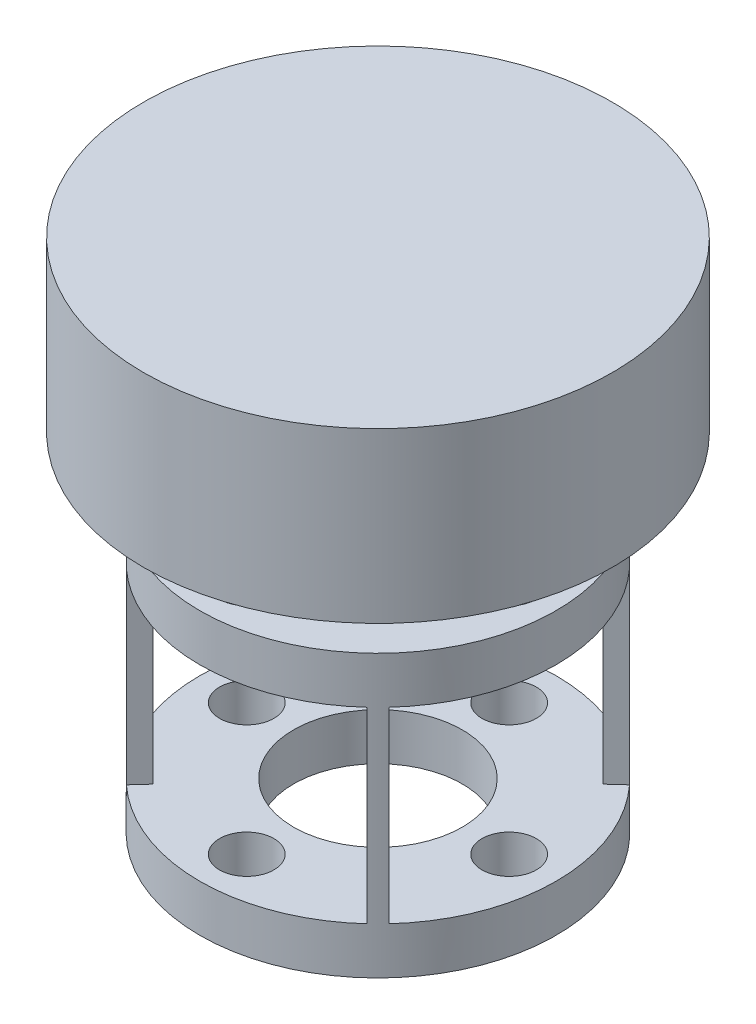
ISO-10303-21;
HEADER;
FILE_DESCRIPTION(('STEP AP214'),'2;1');
FILE_NAME('part.step','',(''),(''),'','','');
FILE_SCHEMA(('AUTOMOTIVE_DESIGN { 1 0 10303 214 1 1 1 1 }'));
ENDSEC;
DATA;
#1=APPLICATION_CONTEXT('core data for automotive mechanical design processes');
#2=APPLICATION_PROTOCOL_DEFINITION('international standard','automotive_design',2000,#1);
#3=PRODUCT_CONTEXT('',#1,'mechanical');
#4=PRODUCT('Part','Part','',(#3));
#5=PRODUCT_RELATED_PRODUCT_CATEGORY('part','',(#4));
#6=PRODUCT_DEFINITION_FORMATION('','',#4);
#7=PRODUCT_DEFINITION_CONTEXT('part definition',#1,'design');
#8=PRODUCT_DEFINITION('design','',#6,#7);
#9=PRODUCT_DEFINITION_SHAPE('','',#8);
#10=(LENGTH_UNIT() NAMED_UNIT(*) SI_UNIT(.MILLI.,.METRE.));
#11=(NAMED_UNIT(*) PLANE_ANGLE_UNIT() SI_UNIT($,.RADIAN.));
#12=(NAMED_UNIT(*) SI_UNIT($,.STERADIAN.) SOLID_ANGLE_UNIT());
#13=UNCERTAINTY_MEASURE_WITH_UNIT(LENGTH_MEASURE(1.E-05),#10,'distance_accuracy_value','');
#14=(GEOMETRIC_REPRESENTATION_CONTEXT(3) GLOBAL_UNCERTAINTY_ASSIGNED_CONTEXT((#13)) GLOBAL_UNIT_ASSIGNED_CONTEXT((#10,
#11,#12)) REPRESENTATION_CONTEXT('',''));
#15=CARTESIAN_POINT('',(0.,0.,0.));
#16=DIRECTION('',(0.,0.,1.));
#17=DIRECTION('',(1.,0.,0.));
#18=AXIS2_PLACEMENT_3D('',#15,#16,#17);
#19=CARTESIAN_POINT('',(0.,55.,0.));
#20=DIRECTION('',(0.,-1.,0.));
#21=DIRECTION('',(0.,0.,-1.));
#22=AXIS2_PLACEMENT_3D('',#19,#20,#21);
#23=CYLINDRICAL_SURFACE('',#22,2.5);
#24=CARTESIAN_POINT('',(0.,35.,0.));
#25=DIRECTION('',(0.,1.,0.));
#26=DIRECTION('',(0.,0.,1.));
#27=AXIS2_PLACEMENT_3D('',#24,#25,#26);
#28=CIRCLE('',#27,2.5);
#29=CARTESIAN_POINT('',(0.,35.,2.5));
#30=VERTEX_POINT('',#29);
#31=EDGE_CURVE('E259',#30,#30,#28,.T.);
#32=ORIENTED_EDGE('',*,*,#31,.T.);
#33=EDGE_LOOP('',(#32));
#34=FACE_BOUND('',#33,.T.);
#35=CARTESIAN_POINT('',(0.,37.,0.));
#36=DIRECTION('',(0.,1.,0.));
#37=DIRECTION('',(0.,0.,1.));
#38=AXIS2_PLACEMENT_3D('',#35,#36,#37);
#39=CIRCLE('',#38,2.5);
#40=CARTESIAN_POINT('',(0.,37.,2.5));
#41=VERTEX_POINT('',#40);
#42=EDGE_CURVE('E12',#41,#41,#39,.T.);
#43=ORIENTED_EDGE('',*,*,#42,.F.);
#44=EDGE_LOOP('',(#43));
#45=FACE_BOUND('',#44,.T.);
#46=ADVANCED_FACE('F53',(#34,#45),#23,.T.);
#47=CARTESIAN_POINT('',(0.,5.,0.));
#48=DIRECTION('',(0.,1.,0.));
#49=DIRECTION('',(0.,0.,1.));
#50=AXIS2_PLACEMENT_3D('',#47,#48,#49);
#51=PLANE('',#50);
#52=CARTESIAN_POINT('',(0.,5.,0.));
#53=DIRECTION('',(0.,1.,0.));
#54=DIRECTION('',(0.,0.,1.));
#55=AXIS2_PLACEMENT_3D('',#52,#53,#54);
#56=CIRCLE('',#55,9.);
#57=CARTESIAN_POINT('',(0.,5.,9.));
#58=VERTEX_POINT('',#57);
#59=EDGE_CURVE('E297',#58,#58,#56,.F.);
#60=ORIENTED_EDGE('',*,*,#59,.T.);
#61=EDGE_LOOP('',(#60));
#62=FACE_BOUND('',#61,.T.);
#63=CARTESIAN_POINT('',(14.,5.,0.));
#64=DIRECTION('',(0.,1.,0.));
#65=DIRECTION('',(0.,0.,1.));
#66=AXIS2_PLACEMENT_3D('',#63,#64,#65);
#67=CIRCLE('',#66,2.9);
#68=CARTESIAN_POINT('',(14.,5.,2.9));
#69=VERTEX_POINT('',#68);
#70=EDGE_CURVE('E365',#69,#69,#67,.F.);
#71=ORIENTED_EDGE('',*,*,#70,.T.);
#72=EDGE_LOOP('',(#71));
#73=FACE_BOUND('',#72,.T.);
#74=CARTESIAN_POINT('',(0.,5.,14.));
#75=DIRECTION('',(0.,1.,0.));
#76=DIRECTION('',(0.,0.,1.));
#77=AXIS2_PLACEMENT_3D('',#74,#75,#76);
#78=CIRCLE('',#77,2.9);
#79=CARTESIAN_POINT('',(0.,5.,16.9));
#80=VERTEX_POINT('',#79);
#81=EDGE_CURVE('E357',#80,#80,#78,.F.);
#82=ORIENTED_EDGE('',*,*,#81,.T.);
#83=EDGE_LOOP('',(#82));
#84=FACE_BOUND('',#83,.T.);
#85=CARTESIAN_POINT('',(0.,5.,-14.));
#86=DIRECTION('',(0.,1.,0.));
#87=DIRECTION('',(0.,0.,1.));
#88=AXIS2_PLACEMENT_3D('',#85,#86,#87);
#89=CIRCLE('',#88,2.9);
#90=CARTESIAN_POINT('',(0.,5.,-11.1));
#91=VERTEX_POINT('',#90);
#92=EDGE_CURVE('E349',#91,#91,#89,.F.);
#93=ORIENTED_EDGE('',*,*,#92,.T.);
#94=EDGE_LOOP('',(#93));
#95=FACE_BOUND('',#94,.T.);
#96=CARTESIAN_POINT('',(-14.,5.,0.));
#97=DIRECTION('',(0.,1.,0.));
#98=DIRECTION('',(0.,0.,1.));
#99=AXIS2_PLACEMENT_3D('',#96,#97,#98);
#100=CIRCLE('',#99,2.9);
#101=CARTESIAN_POINT('',(-14.,5.,2.9));
#102=VERTEX_POINT('',#101);
#103=EDGE_CURVE('E341',#102,#102,#100,.F.);
#104=ORIENTED_EDGE('',*,*,#103,.T.);
#105=EDGE_LOOP('',(#104));
#106=FACE_BOUND('',#105,.T.);
#107=CARTESIAN_POINT('',(0.,5.,0.));
#108=DIRECTION('',(0.,1.,0.));
#109=DIRECTION('',(0.,0.,1.));
#110=AXIS2_PLACEMENT_3D('',#107,#108,#109);
#111=CIRCLE('',#110,19.);
#112=CARTESIAN_POINT('',(-12.8362139446975,5.,14.0082693993924));
#113=VERTEX_POINT('',#112);
#114=CARTESIAN_POINT('',(12.8362139446977,5.,14.0082693993922));
#115=VERTEX_POINT('',#114);
#116=EDGE_CURVE('E252',#113,#115,#111,.T.);
#117=ORIENTED_EDGE('',*,*,#116,.T.);
#118=DIRECTION('',(-0.675590207615618,0.,-0.737277336810162));
#119=VECTOR('',#118,1.);
#120=CARTESIAN_POINT('',(12.8362139446977,5.,14.0082693993922));
#121=LINE('',#120,#119);
#122=CARTESIAN_POINT('',(11.4850335294665,5.,12.5337147257719));
#123=VERTEX_POINT('',#122);
#124=EDGE_CURVE('E69',#115,#123,#121,.T.);
#125=ORIENTED_EDGE('',*,*,#124,.T.);
#126=CARTESIAN_POINT('',(0.,5.,0.));
#127=DIRECTION('',(0.,-1.,0.));
#128=DIRECTION('',(0.,0.,-1.));
#129=AXIS2_PLACEMENT_3D('',#126,#127,#128);
#130=CIRCLE('',#129,17.);
#131=CARTESIAN_POINT('',(12.5337147257722,5.,11.4850335294661));
#132=VERTEX_POINT('',#131);
#133=EDGE_CURVE('E447',#132,#123,#130,.T.);
#134=ORIENTED_EDGE('',*,*,#133,.F.);
#135=DIRECTION('',(-0.737277336810099,0.,-0.675590207615687));
#136=VECTOR('',#135,1.);
#137=CARTESIAN_POINT('',(14.0082693993924,5.,12.8362139446975));
#138=LINE('',#137,#136);
#139=CARTESIAN_POINT('',(14.0082693993924,5.,12.8362139446975));
#140=VERTEX_POINT('',#139);
#141=EDGE_CURVE('E212',#140,#132,#138,.T.);
#142=ORIENTED_EDGE('',*,*,#141,.F.);
#143=CARTESIAN_POINT('',(14.0082693993922,5.,-12.8362139446977));
#144=VERTEX_POINT('',#143);
#145=EDGE_CURVE('E186',#140,#144,#111,.T.);
#146=ORIENTED_EDGE('',*,*,#145,.T.);
#147=DIRECTION('',(-0.737277336810131,0.,0.675590207615653));
#148=VECTOR('',#147,1.);
#149=CARTESIAN_POINT('',(14.0082693993922,5.,-12.8362139446977));
#150=LINE('',#149,#148);
#151=CARTESIAN_POINT('',(12.5337147257719,5.,-11.4850335294664));
#152=VERTEX_POINT('',#151);
#153=EDGE_CURVE('E76',#144,#152,#150,.T.);
#154=ORIENTED_EDGE('',*,*,#153,.T.);
#155=CARTESIAN_POINT('',(0.,5.,0.));
#156=DIRECTION('',(0.,-1.,0.));
#157=DIRECTION('',(0.,0.,-1.));
#158=AXIS2_PLACEMENT_3D('',#155,#156,#157);
#159=CIRCLE('',#158,17.);
#160=CARTESIAN_POINT('',(11.4850335294662,5.,-12.5337147257722));
#161=VERTEX_POINT('',#160);
#162=EDGE_CURVE('E429',#161,#152,#159,.T.);
#163=ORIENTED_EDGE('',*,*,#162,.F.);
#164=DIRECTION('',(-0.675590207615654,0.,0.73727733681013));
#165=VECTOR('',#164,1.);
#166=CARTESIAN_POINT('',(12.8362139446975,5.,-14.0082693993924));
#167=LINE('',#166,#165);
#168=CARTESIAN_POINT('',(12.8362139446975,5.,-14.0082693993924));
#169=VERTEX_POINT('',#168);
#170=EDGE_CURVE('E425',#169,#161,#167,.T.);
#171=ORIENTED_EDGE('',*,*,#170,.F.);
#172=CARTESIAN_POINT('',(-12.8362139446977,5.,-14.0082693993922));
#173=VERTEX_POINT('',#172);
#174=EDGE_CURVE('E455',#169,#173,#111,.T.);
#175=ORIENTED_EDGE('',*,*,#174,.T.);
#176=DIRECTION('',(0.675590207615668,0.,0.737277336810117));
#177=VECTOR('',#176,1.);
#178=CARTESIAN_POINT('',(-12.8362139446977,5.,-14.0082693993922));
#179=LINE('',#178,#177);
#180=CARTESIAN_POINT('',(-11.4850335294664,5.,-12.533714725772));
#181=VERTEX_POINT('',#180);
#182=EDGE_CURVE('E229',#173,#181,#179,.T.);
#183=ORIENTED_EDGE('',*,*,#182,.T.);
#184=CARTESIAN_POINT('',(0.,5.,0.));
#185=DIRECTION('',(0.,-1.,0.));
#186=DIRECTION('',(0.,0.,-1.));
#187=AXIS2_PLACEMENT_3D('',#184,#185,#186);
#188=CIRCLE('',#187,17.);
#189=CARTESIAN_POINT('',(-12.5337147257722,5.,-11.4850335294661));
#190=VERTEX_POINT('',#189);
#191=EDGE_CURVE('E395',#190,#181,#188,.T.);
#192=ORIENTED_EDGE('',*,*,#191,.F.);
#193=DIRECTION('',(0.737277336810127,0.,0.675590207615657));
#194=VECTOR('',#193,1.);
#195=CARTESIAN_POINT('',(-14.0082693993924,5.,-12.8362139446975));
#196=LINE('',#195,#194);
#197=CARTESIAN_POINT('',(-14.0082693993924,5.,-12.8362139446975));
#198=VERTEX_POINT('',#197);
#199=EDGE_CURVE('E391',#198,#190,#196,.T.);
#200=ORIENTED_EDGE('',*,*,#199,.F.);
#201=CARTESIAN_POINT('',(-14.0082693993922,5.,12.8362139446977));
#202=VERTEX_POINT('',#201);
#203=EDGE_CURVE('E255',#198,#202,#111,.T.);
#204=ORIENTED_EDGE('',*,*,#203,.T.);
#205=DIRECTION('',(0.737277336810131,0.,-0.675590207615653));
#206=VECTOR('',#205,1.);
#207=CARTESIAN_POINT('',(-14.0082693993922,5.,12.8362139446977));
#208=LINE('',#207,#206);
#209=CARTESIAN_POINT('',(-12.5337147257719,5.,11.4850335294664));
#210=VERTEX_POINT('',#209);
#211=EDGE_CURVE('E225',#202,#210,#208,.T.);
#212=ORIENTED_EDGE('',*,*,#211,.T.);
#213=CARTESIAN_POINT('',(0.,5.,0.));
#214=DIRECTION('',(0.,-1.,0.));
#215=DIRECTION('',(0.,0.,-1.));
#216=AXIS2_PLACEMENT_3D('',#213,#214,#215);
#217=CIRCLE('',#216,17.);
#218=CARTESIAN_POINT('',(-11.4850335294662,5.,12.5337147257722));
#219=VERTEX_POINT('',#218);
#220=EDGE_CURVE('E228',#219,#210,#217,.T.);
#221=ORIENTED_EDGE('',*,*,#220,.F.);
#222=DIRECTION('',(0.675590207615654,0.,-0.73727733681013));
#223=VECTOR('',#222,1.);
#224=CARTESIAN_POINT('',(-12.8362139446975,5.,14.0082693993924));
#225=LINE('',#224,#223);
#226=EDGE_CURVE('E218',#113,#219,#225,.T.);
#227=ORIENTED_EDGE('',*,*,#226,.F.);
#228=EDGE_LOOP('',(#117,#125,#134,#142,#146,#154,#163,#171,#175,#183,#192,#200,#204,#212,#221,#227));
#229=FACE_BOUND('',#228,.T.);
#230=ADVANCED_FACE('F277',(#62,#73,#84,#95,#106,#229),#51,.T.);
#231=CARTESIAN_POINT('',(0.,5.,0.));
#232=DIRECTION('',(0.,-1.,0.));
#233=DIRECTION('',(0.,0.,-1.));
#234=AXIS2_PLACEMENT_3D('',#231,#232,#233);
#235=CYLINDRICAL_SURFACE('',#234,19.);
#236=CARTESIAN_POINT('',(0.,25.,0.));
#237=DIRECTION('',(0.,1.,0.));
#238=DIRECTION('',(0.,0.,1.));
#239=AXIS2_PLACEMENT_3D('',#236,#237,#238);
#240=CIRCLE('',#239,19.);
#241=CARTESIAN_POINT('',(-14.0082693993924,25.,-12.8362139446975));
#242=VERTEX_POINT('',#241);
#243=CARTESIAN_POINT('',(-14.0082693993922,25.,12.8362139446977));
#244=VERTEX_POINT('',#243);
#245=EDGE_CURVE('E373',#242,#244,#240,.T.);
#246=ORIENTED_EDGE('',*,*,#245,.T.);
#247=DIRECTION('',(0.,-1.,0.));
#248=VECTOR('',#247,1.);
#249=CARTESIAN_POINT('',(-14.0082693993922,25.,12.8362139446977));
#250=LINE('',#249,#248);
#251=EDGE_CURVE('E224',#244,#202,#250,.T.);
#252=ORIENTED_EDGE('',*,*,#251,.T.);
#253=ORIENTED_EDGE('',*,*,#203,.F.);
#254=DIRECTION('',(0.,-1.,0.));
#255=VECTOR('',#254,1.);
#256=CARTESIAN_POINT('',(-14.0082693993924,25.,-12.8362139446975));
#257=LINE('',#256,#255);
#258=EDGE_CURVE('E387',#242,#198,#257,.T.);
#259=ORIENTED_EDGE('',*,*,#258,.F.);
#260=EDGE_LOOP('',(#246,#252,#253,#259));
#261=FACE_BOUND('',#260,.T.);
#262=CARTESIAN_POINT('',(12.8362139446975,25.,-14.0082693993924));
#263=VERTEX_POINT('',#262);
#264=CARTESIAN_POINT('',(-12.8362139446977,25.,-14.0082693993922));
#265=VERTEX_POINT('',#264);
#266=EDGE_CURVE('E178',#263,#265,#240,.T.);
#267=ORIENTED_EDGE('',*,*,#266,.T.);
#268=DIRECTION('',(0.,-1.,0.));
#269=VECTOR('',#268,1.);
#270=CARTESIAN_POINT('',(-12.8362139446977,25.,-14.0082693993922));
#271=LINE('',#270,#269);
#272=EDGE_CURVE('E374',#265,#173,#271,.T.);
#273=ORIENTED_EDGE('',*,*,#272,.T.);
#274=ORIENTED_EDGE('',*,*,#174,.F.);
#275=DIRECTION('',(0.,-1.,0.));
#276=VECTOR('',#275,1.);
#277=CARTESIAN_POINT('',(12.8362139446975,25.,-14.0082693993924));
#278=LINE('',#277,#276);
#279=EDGE_CURVE('E421',#263,#169,#278,.T.);
#280=ORIENTED_EDGE('',*,*,#279,.F.);
#281=EDGE_LOOP('',(#267,#273,#274,#280));
#282=FACE_BOUND('',#281,.T.);
#283=CARTESIAN_POINT('',(14.0082693993924,25.,12.8362139446975));
#284=VERTEX_POINT('',#283);
#285=CARTESIAN_POINT('',(14.0082693993922,25.,-12.8362139446977));
#286=VERTEX_POINT('',#285);
#287=EDGE_CURVE('E165',#284,#286,#240,.T.);
#288=ORIENTED_EDGE('',*,*,#287,.T.);
#289=DIRECTION('',(0.,-1.,0.));
#290=VECTOR('',#289,1.);
#291=CARTESIAN_POINT('',(14.0082693993922,25.,-12.8362139446977));
#292=LINE('',#291,#290);
#293=EDGE_CURVE('E410',#286,#144,#292,.T.);
#294=ORIENTED_EDGE('',*,*,#293,.T.);
#295=ORIENTED_EDGE('',*,*,#145,.F.);
#296=DIRECTION('',(0.,-1.,0.));
#297=VECTOR('',#296,1.);
#298=CARTESIAN_POINT('',(14.0082693993924,25.,12.8362139446975));
#299=LINE('',#298,#297);
#300=EDGE_CURVE('E183',#284,#140,#299,.T.);
#301=ORIENTED_EDGE('',*,*,#300,.F.);
#302=EDGE_LOOP('',(#288,#294,#295,#301));
#303=FACE_BOUND('',#302,.T.);
#304=DIRECTION('',(0.,-1.,0.));
#305=VECTOR('',#304,1.);
#306=CARTESIAN_POINT('',(-12.8362139446975,25.,14.0082693993924));
#307=LINE('',#306,#305);
#308=CARTESIAN_POINT('',(-12.8362139446975,25.,14.0082693993924));
#309=VERTEX_POINT('',#308);
#310=EDGE_CURVE('E236',#309,#113,#307,.T.);
#311=ORIENTED_EDGE('',*,*,#310,.F.);
#312=CARTESIAN_POINT('',(12.8362139446977,25.,14.0082693993922));
#313=VERTEX_POINT('',#312);
#314=EDGE_CURVE('E180',#309,#313,#240,.T.);
#315=ORIENTED_EDGE('',*,*,#314,.T.);
#316=DIRECTION('',(0.,-1.,0.));
#317=VECTOR('',#316,1.);
#318=CARTESIAN_POINT('',(12.8362139446977,25.,14.0082693993922));
#319=LINE('',#318,#317);
#320=EDGE_CURVE('E197',#313,#115,#319,.T.);
#321=ORIENTED_EDGE('',*,*,#320,.T.);
#322=ORIENTED_EDGE('',*,*,#116,.F.);
#323=EDGE_LOOP('',(#311,#315,#321,#322));
#324=FACE_BOUND('',#323,.T.);
#325=CARTESIAN_POINT('',(0.,0.,0.));
#326=DIRECTION('',(0.,1.,0.));
#327=DIRECTION('',(0.,0.,1.));
#328=AXIS2_PLACEMENT_3D('',#325,#326,#327);
#329=CIRCLE('',#328,19.);
#330=CARTESIAN_POINT('',(0.,0.,19.));
#331=VERTEX_POINT('',#330);
#332=EDGE_CURVE('E240',#331,#331,#329,.T.);
#333=ORIENTED_EDGE('',*,*,#332,.T.);
#334=EDGE_LOOP('',(#333));
#335=FACE_BOUND('',#334,.T.);
#336=CARTESIAN_POINT('',(0.,30.,0.));
#337=DIRECTION('',(0.,1.,0.));
#338=DIRECTION('',(0.,0.,1.));
#339=AXIS2_PLACEMENT_3D('',#336,#337,#338);
#340=CIRCLE('',#339,19.);
#341=CARTESIAN_POINT('',(0.,30.,19.));
#342=VERTEX_POINT('',#341);
#343=EDGE_CURVE('E177',#342,#342,#340,.T.);
#344=ORIENTED_EDGE('',*,*,#343,.F.);
#345=EDGE_LOOP('',(#344));
#346=FACE_BOUND('',#345,.T.);
#347=ADVANCED_FACE('F184',(#261,#282,#303,#324,#335,#346),#235,.T.);
#348=CARTESIAN_POINT('',(0.,0.,0.));
#349=DIRECTION('',(0.,1.,0.));
#350=DIRECTION('',(0.,0.,1.));
#351=AXIS2_PLACEMENT_3D('',#348,#349,#350);
#352=PLANE('',#351);
#353=CARTESIAN_POINT('',(0.,0.,0.));
#354=DIRECTION('',(0.,1.,0.));
#355=DIRECTION('',(0.,0.,1.));
#356=AXIS2_PLACEMENT_3D('',#353,#354,#355);
#357=CIRCLE('',#356,9.);
#358=CARTESIAN_POINT('',(0.,0.,9.));
#359=VERTEX_POINT('',#358);
#360=EDGE_CURVE('E291',#359,#359,#357,.T.);
#361=ORIENTED_EDGE('',*,*,#360,.T.);
#362=EDGE_LOOP('',(#361));
#363=FACE_BOUND('',#362,.T.);
#364=CARTESIAN_POINT('',(14.,0.,0.));
#365=DIRECTION('',(0.,1.,0.));
#366=DIRECTION('',(0.,0.,1.));
#367=AXIS2_PLACEMENT_3D('',#364,#365,#366);
#368=CIRCLE('',#367,2.9);
#369=CARTESIAN_POINT('',(14.,0.,2.9));
#370=VERTEX_POINT('',#369);
#371=EDGE_CURVE('E306',#370,#370,#368,.T.);
#372=ORIENTED_EDGE('',*,*,#371,.T.);
#373=EDGE_LOOP('',(#372));
#374=FACE_BOUND('',#373,.T.);
#375=CARTESIAN_POINT('',(0.,0.,14.));
#376=DIRECTION('',(0.,1.,0.));
#377=DIRECTION('',(0.,0.,1.));
#378=AXIS2_PLACEMENT_3D('',#375,#376,#377);
#379=CIRCLE('',#378,2.9);
#380=CARTESIAN_POINT('',(0.,0.,16.9));
#381=VERTEX_POINT('',#380);
#382=EDGE_CURVE('E311',#381,#381,#379,.T.);
#383=ORIENTED_EDGE('',*,*,#382,.T.);
#384=EDGE_LOOP('',(#383));
#385=FACE_BOUND('',#384,.T.);
#386=CARTESIAN_POINT('',(0.,0.,-14.));
#387=DIRECTION('',(0.,1.,0.));
#388=DIRECTION('',(0.,0.,1.));
#389=AXIS2_PLACEMENT_3D('',#386,#387,#388);
#390=CIRCLE('',#389,2.9);
#391=CARTESIAN_POINT('',(0.,0.,-11.1));
#392=VERTEX_POINT('',#391);
#393=EDGE_CURVE('E320',#392,#392,#390,.T.);
#394=ORIENTED_EDGE('',*,*,#393,.T.);
#395=EDGE_LOOP('',(#394));
#396=FACE_BOUND('',#395,.T.);
#397=CARTESIAN_POINT('',(-14.,0.,0.));
#398=DIRECTION('',(0.,1.,0.));
#399=DIRECTION('',(0.,0.,1.));
#400=AXIS2_PLACEMENT_3D('',#397,#398,#399);
#401=CIRCLE('',#400,2.9);
#402=CARTESIAN_POINT('',(-14.,0.,2.9));
#403=VERTEX_POINT('',#402);
#404=EDGE_CURVE('E328',#403,#403,#401,.T.);
#405=ORIENTED_EDGE('',*,*,#404,.T.);
#406=EDGE_LOOP('',(#405));
#407=FACE_BOUND('',#406,.T.);
#408=ORIENTED_EDGE('',*,*,#332,.F.);
#409=EDGE_LOOP('',(#408));
#410=FACE_BOUND('',#409,.T.);
#411=ADVANCED_FACE('F519',(#363,#374,#385,#396,#407,#410),#352,.F.);
#412=CARTESIAN_POINT('',(-12.8362139446975,25.,14.0082693993924));
#413=DIRECTION('',(-0.73727733681013,0.,-0.675590207615654));
#414=DIRECTION('',(-0.675590207615654,0.,0.73727733681013));
#415=AXIS2_PLACEMENT_3D('',#412,#413,#414);
#416=PLANE('',#415);
#417=ORIENTED_EDGE('',*,*,#226,.T.);
#418=DIRECTION('',(0.,-1.,0.));
#419=VECTOR('',#418,1.);
#420=CARTESIAN_POINT('',(-11.4850335294662,25.,12.5337147257722));
#421=LINE('',#420,#419);
#422=CARTESIAN_POINT('',(-11.4850335294662,25.,12.5337147257722));
#423=VERTEX_POINT('',#422);
#424=EDGE_CURVE('E241',#423,#219,#421,.T.);
#425=ORIENTED_EDGE('',*,*,#424,.F.);
#426=DIRECTION('',(0.675590207615654,0.,-0.73727733681013));
#427=VECTOR('',#426,1.);
#428=CARTESIAN_POINT('',(-12.8362139446975,25.,14.0082693993924));
#429=LINE('',#428,#427);
#430=EDGE_CURVE('E221',#309,#423,#429,.T.);
#431=ORIENTED_EDGE('',*,*,#430,.F.);
#432=ORIENTED_EDGE('',*,*,#310,.T.);
#433=EDGE_LOOP('',(#417,#425,#431,#432));
#434=FACE_BOUND('',#433,.T.);
#435=ADVANCED_FACE('F496',(#434),#416,.F.);
#436=CARTESIAN_POINT('',(0.,25.,0.));
#437=DIRECTION('',(0.,-1.,0.));
#438=DIRECTION('',(0.,0.,-1.));
#439=AXIS2_PLACEMENT_3D('',#436,#437,#438);
#440=CYLINDRICAL_SURFACE('',#439,17.);
#441=ORIENTED_EDGE('',*,*,#220,.T.);
#442=DIRECTION('',(0.,-1.,0.));
#443=VECTOR('',#442,1.);
#444=CARTESIAN_POINT('',(-12.5337147257719,25.,11.4850335294664));
#445=LINE('',#444,#443);
#446=CARTESIAN_POINT('',(-12.5337147257719,25.,11.4850335294664));
#447=VERTEX_POINT('',#446);
#448=EDGE_CURVE('E245',#447,#210,#445,.T.);
#449=ORIENTED_EDGE('',*,*,#448,.F.);
#450=CARTESIAN_POINT('',(0.,25.,0.));
#451=DIRECTION('',(0.,-1.,0.));
#452=DIRECTION('',(0.,0.,-1.));
#453=AXIS2_PLACEMENT_3D('',#450,#451,#452);
#454=CIRCLE('',#453,17.);
#455=EDGE_CURVE('E217',#423,#447,#454,.T.);
#456=ORIENTED_EDGE('',*,*,#455,.F.);
#457=ORIENTED_EDGE('',*,*,#424,.T.);
#458=EDGE_LOOP('',(#441,#449,#456,#457));
#459=FACE_BOUND('',#458,.T.);
#460=ADVANCED_FACE('F500',(#459),#440,.F.);
#461=CARTESIAN_POINT('',(-14.0082693993922,25.,12.8362139446977));
#462=DIRECTION('',(-0.675590207615653,0.,-0.737277336810131));
#463=DIRECTION('',(-0.737277336810131,0.,0.675590207615653));
#464=AXIS2_PLACEMENT_3D('',#461,#462,#463);
#465=PLANE('',#464);
#466=ORIENTED_EDGE('',*,*,#211,.F.);
#467=ORIENTED_EDGE('',*,*,#251,.F.);
#468=DIRECTION('',(0.737277336810131,0.,-0.675590207615653));
#469=VECTOR('',#468,1.);
#470=CARTESIAN_POINT('',(-14.0082693993922,25.,12.8362139446977));
#471=LINE('',#470,#469);
#472=EDGE_CURVE('E213',#244,#447,#471,.T.);
#473=ORIENTED_EDGE('',*,*,#472,.T.);
#474=ORIENTED_EDGE('',*,*,#448,.T.);
#475=EDGE_LOOP('',(#466,#467,#473,#474));
#476=FACE_BOUND('',#475,.T.);
#477=ADVANCED_FACE('F490',(#476),#465,.T.);
#478=CARTESIAN_POINT('',(-14.0082693993924,25.,-12.8362139446975));
#479=DIRECTION('',(0.675590207615657,0.,-0.737277336810127));
#480=DIRECTION('',(-0.737277336810127,0.,-0.675590207615657));
#481=AXIS2_PLACEMENT_3D('',#478,#479,#480);
#482=PLANE('',#481);
#483=ORIENTED_EDGE('',*,*,#199,.T.);
#484=DIRECTION('',(0.,-1.,0.));
#485=VECTOR('',#484,1.);
#486=CARTESIAN_POINT('',(-12.5337147257722,25.,-11.4850335294661));
#487=LINE('',#486,#485);
#488=CARTESIAN_POINT('',(-12.5337147257722,25.,-11.4850335294661));
#489=VERTEX_POINT('',#488);
#490=EDGE_CURVE('E383',#489,#190,#487,.T.);
#491=ORIENTED_EDGE('',*,*,#490,.F.);
#492=DIRECTION('',(0.737277336810127,0.,0.675590207615657));
#493=VECTOR('',#492,1.);
#494=CARTESIAN_POINT('',(-14.0082693993924,25.,-12.8362139446975));
#495=LINE('',#494,#493);
#496=EDGE_CURVE('E378',#242,#489,#495,.T.);
#497=ORIENTED_EDGE('',*,*,#496,.F.);
#498=ORIENTED_EDGE('',*,*,#258,.T.);
#499=EDGE_LOOP('',(#483,#491,#497,#498));
#500=FACE_BOUND('',#499,.T.);
#501=ADVANCED_FACE('F482',(#500),#482,.F.);
#502=CARTESIAN_POINT('',(0.,25.,0.));
#503=DIRECTION('',(0.,-1.,0.));
#504=DIRECTION('',(0.,0.,-1.));
#505=AXIS2_PLACEMENT_3D('',#502,#503,#504);
#506=CYLINDRICAL_SURFACE('',#505,17.);
#507=ORIENTED_EDGE('',*,*,#191,.T.);
#508=DIRECTION('',(0.,-1.,0.));
#509=VECTOR('',#508,1.);
#510=CARTESIAN_POINT('',(-11.4850335294664,25.,-12.533714725772));
#511=LINE('',#510,#509);
#512=CARTESIAN_POINT('',(-11.4850335294664,25.,-12.533714725772));
#513=VERTEX_POINT('',#512);
#514=EDGE_CURVE('E379',#513,#181,#511,.T.);
#515=ORIENTED_EDGE('',*,*,#514,.F.);
#516=CARTESIAN_POINT('',(0.,25.,0.));
#517=DIRECTION('',(0.,-1.,0.));
#518=DIRECTION('',(0.,0.,-1.));
#519=AXIS2_PLACEMENT_3D('',#516,#517,#518);
#520=CIRCLE('',#519,17.);
#521=EDGE_CURVE('E404',#489,#513,#520,.T.);
#522=ORIENTED_EDGE('',*,*,#521,.F.);
#523=ORIENTED_EDGE('',*,*,#490,.T.);
#524=EDGE_LOOP('',(#507,#515,#522,#523));
#525=FACE_BOUND('',#524,.T.);
#526=ADVANCED_FACE('F478',(#525),#506,.F.);
#527=CARTESIAN_POINT('',(-12.8362139446977,25.,-14.0082693993922));
#528=DIRECTION('',(0.737277336810117,0.,-0.675590207615668));
#529=DIRECTION('',(-0.675590207615668,0.,-0.737277336810117));
#530=AXIS2_PLACEMENT_3D('',#527,#528,#529);
#531=PLANE('',#530);
#532=ORIENTED_EDGE('',*,*,#182,.F.);
#533=ORIENTED_EDGE('',*,*,#272,.F.);
#534=DIRECTION('',(0.675590207615668,0.,0.737277336810117));
#535=VECTOR('',#534,1.);
#536=CARTESIAN_POINT('',(-12.8362139446977,25.,-14.0082693993922));
#537=LINE('',#536,#535);
#538=EDGE_CURVE('E396',#265,#513,#537,.T.);
#539=ORIENTED_EDGE('',*,*,#538,.T.);
#540=ORIENTED_EDGE('',*,*,#514,.T.);
#541=EDGE_LOOP('',(#532,#533,#539,#540));
#542=FACE_BOUND('',#541,.T.);
#543=ADVANCED_FACE('F475',(#542),#531,.T.);
#544=CARTESIAN_POINT('',(12.8362139446975,25.,-14.0082693993924));
#545=DIRECTION('',(0.73727733681013,0.,0.675590207615654));
#546=DIRECTION('',(0.675590207615654,0.,-0.73727733681013));
#547=AXIS2_PLACEMENT_3D('',#544,#545,#546);
#548=PLANE('',#547);
#549=ORIENTED_EDGE('',*,*,#170,.T.);
#550=DIRECTION('',(0.,-1.,0.));
#551=VECTOR('',#550,1.);
#552=CARTESIAN_POINT('',(11.4850335294662,25.,-12.5337147257722));
#553=LINE('',#552,#551);
#554=CARTESIAN_POINT('',(11.4850335294662,25.,-12.5337147257722));
#555=VERTEX_POINT('',#554);
#556=EDGE_CURVE('E417',#555,#161,#553,.T.);
#557=ORIENTED_EDGE('',*,*,#556,.F.);
#558=DIRECTION('',(-0.675590207615654,0.,0.73727733681013));
#559=VECTOR('',#558,1.);
#560=CARTESIAN_POINT('',(12.8362139446975,25.,-14.0082693993924));
#561=LINE('',#560,#559);
#562=EDGE_CURVE('E413',#263,#555,#561,.T.);
#563=ORIENTED_EDGE('',*,*,#562,.F.);
#564=ORIENTED_EDGE('',*,*,#279,.T.);
#565=EDGE_LOOP('',(#549,#557,#563,#564));
#566=FACE_BOUND('',#565,.T.);
#567=ADVANCED_FACE('F466',(#566),#548,.F.);
#568=CARTESIAN_POINT('',(0.,25.,0.));
#569=DIRECTION('',(0.,-1.,0.));
#570=DIRECTION('',(0.,0.,-1.));
#571=AXIS2_PLACEMENT_3D('',#568,#569,#570);
#572=CYLINDRICAL_SURFACE('',#571,17.);
#573=ORIENTED_EDGE('',*,*,#162,.T.);
#574=DIRECTION('',(0.,-1.,0.));
#575=VECTOR('',#574,1.);
#576=CARTESIAN_POINT('',(12.5337147257719,25.,-11.4850335294664));
#577=LINE('',#576,#575);
#578=CARTESIAN_POINT('',(12.5337147257719,25.,-11.4850335294664));
#579=VERTEX_POINT('',#578);
#580=EDGE_CURVE('E414',#579,#152,#577,.T.);
#581=ORIENTED_EDGE('',*,*,#580,.F.);
#582=CARTESIAN_POINT('',(0.,25.,0.));
#583=DIRECTION('',(0.,-1.,0.));
#584=DIRECTION('',(0.,0.,-1.));
#585=AXIS2_PLACEMENT_3D('',#582,#583,#584);
#586=CIRCLE('',#585,17.);
#587=EDGE_CURVE('E437',#555,#579,#586,.T.);
#588=ORIENTED_EDGE('',*,*,#587,.F.);
#589=ORIENTED_EDGE('',*,*,#556,.T.);
#590=EDGE_LOOP('',(#573,#581,#588,#589));
#591=FACE_BOUND('',#590,.T.);
#592=ADVANCED_FACE('F462',(#591),#572,.F.);
#593=CARTESIAN_POINT('',(14.0082693993922,25.,-12.8362139446977));
#594=DIRECTION('',(0.675590207615653,0.,0.737277336810131));
#595=DIRECTION('',(0.737277336810131,0.,-0.675590207615653));
#596=AXIS2_PLACEMENT_3D('',#593,#594,#595);
#597=PLANE('',#596);
#598=ORIENTED_EDGE('',*,*,#153,.F.);
#599=ORIENTED_EDGE('',*,*,#293,.F.);
#600=DIRECTION('',(-0.737277336810131,0.,0.675590207615653));
#601=VECTOR('',#600,1.);
#602=CARTESIAN_POINT('',(14.0082693993922,25.,-12.8362139446977));
#603=LINE('',#602,#601);
#604=EDGE_CURVE('E172',#286,#579,#603,.T.);
#605=ORIENTED_EDGE('',*,*,#604,.T.);
#606=ORIENTED_EDGE('',*,*,#580,.T.);
#607=EDGE_LOOP('',(#598,#599,#605,#606));
#608=FACE_BOUND('',#607,.T.);
#609=ADVANCED_FACE('F458',(#608),#597,.T.);
#610=CARTESIAN_POINT('',(14.0082693993924,25.,12.8362139446975));
#611=DIRECTION('',(-0.675590207615687,0.,0.737277336810099));
#612=DIRECTION('',(0.737277336810099,0.,0.675590207615687));
#613=AXIS2_PLACEMENT_3D('',#610,#611,#612);
#614=PLANE('',#613);
#615=ORIENTED_EDGE('',*,*,#141,.T.);
#616=DIRECTION('',(0.,-1.,0.));
#617=VECTOR('',#616,1.);
#618=CARTESIAN_POINT('',(12.5337147257722,25.,11.4850335294661));
#619=LINE('',#618,#617);
#620=CARTESIAN_POINT('',(12.5337147257722,25.,11.4850335294661));
#621=VERTEX_POINT('',#620);
#622=EDGE_CURVE('E190',#621,#132,#619,.T.);
#623=ORIENTED_EDGE('',*,*,#622,.F.);
#624=DIRECTION('',(-0.737277336810099,0.,-0.675590207615687));
#625=VECTOR('',#624,1.);
#626=CARTESIAN_POINT('',(14.0082693993924,25.,12.8362139446975));
#627=LINE('',#626,#625);
#628=EDGE_CURVE('E169',#284,#621,#627,.T.);
#629=ORIENTED_EDGE('',*,*,#628,.F.);
#630=ORIENTED_EDGE('',*,*,#300,.T.);
#631=EDGE_LOOP('',(#615,#623,#629,#630));
#632=FACE_BOUND('',#631,.T.);
#633=ADVANCED_FACE('F192',(#632),#614,.F.);
#634=CARTESIAN_POINT('',(0.,25.,0.));
#635=DIRECTION('',(0.,-1.,0.));
#636=DIRECTION('',(0.,0.,-1.));
#637=AXIS2_PLACEMENT_3D('',#634,#635,#636);
#638=CYLINDRICAL_SURFACE('',#637,17.);
#639=ORIENTED_EDGE('',*,*,#133,.T.);
#640=DIRECTION('',(0.,-1.,0.));
#641=VECTOR('',#640,1.);
#642=CARTESIAN_POINT('',(11.4850335294665,25.,12.5337147257719));
#643=LINE('',#642,#641);
#644=CARTESIAN_POINT('',(11.4850335294665,25.,12.5337147257719));
#645=VERTEX_POINT('',#644);
#646=EDGE_CURVE('E204',#645,#123,#643,.T.);
#647=ORIENTED_EDGE('',*,*,#646,.F.);
#648=CARTESIAN_POINT('',(0.,25.,0.));
#649=DIRECTION('',(0.,-1.,0.));
#650=DIRECTION('',(0.,0.,-1.));
#651=AXIS2_PLACEMENT_3D('',#648,#649,#650);
#652=CIRCLE('',#651,17.);
#653=EDGE_CURVE('E196',#621,#645,#652,.T.);
#654=ORIENTED_EDGE('',*,*,#653,.F.);
#655=ORIENTED_EDGE('',*,*,#622,.T.);
#656=EDGE_LOOP('',(#639,#647,#654,#655));
#657=FACE_BOUND('',#656,.T.);
#658=ADVANCED_FACE('F506',(#657),#638,.F.);
#659=CARTESIAN_POINT('',(12.8362139446977,25.,14.0082693993922));
#660=DIRECTION('',(-0.737277336810162,0.,0.675590207615618));
#661=DIRECTION('',(0.675590207615619,0.,0.737277336810162));
#662=AXIS2_PLACEMENT_3D('',#659,#660,#661);
#663=PLANE('',#662);
#664=ORIENTED_EDGE('',*,*,#124,.F.);
#665=ORIENTED_EDGE('',*,*,#320,.F.);
#666=DIRECTION('',(-0.675590207615618,0.,-0.737277336810162));
#667=VECTOR('',#666,1.);
#668=CARTESIAN_POINT('',(12.8362139446977,25.,14.0082693993922));
#669=LINE('',#668,#667);
#670=EDGE_CURVE('E201',#313,#645,#669,.T.);
#671=ORIENTED_EDGE('',*,*,#670,.T.);
#672=ORIENTED_EDGE('',*,*,#646,.T.);
#673=EDGE_LOOP('',(#664,#665,#671,#672));
#674=FACE_BOUND('',#673,.T.);
#675=ADVANCED_FACE('F505',(#674),#663,.T.);
#676=CARTESIAN_POINT('',(0.,25.,0.));
#677=DIRECTION('',(0.,1.,0.));
#678=DIRECTION('',(0.,0.,1.));
#679=AXIS2_PLACEMENT_3D('',#676,#677,#678);
#680=PLANE('',#679);
#681=CARTESIAN_POINT('',(14.,25.,0.));
#682=DIRECTION('',(0.,1.,0.));
#683=DIRECTION('',(0.,0.,1.));
#684=AXIS2_PLACEMENT_3D('',#681,#682,#683);
#685=CIRCLE('',#684,2.9);
#686=CARTESIAN_POINT('',(14.,25.,2.9));
#687=VERTEX_POINT('',#686);
#688=EDGE_CURVE('E361',#687,#687,#685,.F.);
#689=ORIENTED_EDGE('',*,*,#688,.F.);
#690=EDGE_LOOP('',(#689));
#691=FACE_BOUND('',#690,.T.);
#692=CARTESIAN_POINT('',(0.,25.,14.));
#693=DIRECTION('',(0.,1.,0.));
#694=DIRECTION('',(0.,0.,1.));
#695=AXIS2_PLACEMENT_3D('',#692,#693,#694);
#696=CIRCLE('',#695,2.9);
#697=CARTESIAN_POINT('',(0.,25.,16.9));
#698=VERTEX_POINT('',#697);
#699=EDGE_CURVE('E353',#698,#698,#696,.F.);
#700=ORIENTED_EDGE('',*,*,#699,.F.);
#701=EDGE_LOOP('',(#700));
#702=FACE_BOUND('',#701,.T.);
#703=CARTESIAN_POINT('',(0.,25.,-14.));
#704=DIRECTION('',(0.,1.,0.));
#705=DIRECTION('',(0.,0.,1.));
#706=AXIS2_PLACEMENT_3D('',#703,#704,#705);
#707=CIRCLE('',#706,2.9);
#708=CARTESIAN_POINT('',(0.,25.,-11.1));
#709=VERTEX_POINT('',#708);
#710=EDGE_CURVE('E345',#709,#709,#707,.F.);
#711=ORIENTED_EDGE('',*,*,#710,.F.);
#712=EDGE_LOOP('',(#711));
#713=FACE_BOUND('',#712,.T.);
#714=CARTESIAN_POINT('',(-14.,25.,0.));
#715=DIRECTION('',(0.,1.,0.));
#716=DIRECTION('',(0.,0.,1.));
#717=AXIS2_PLACEMENT_3D('',#714,#715,#716);
#718=CIRCLE('',#717,2.9);
#719=CARTESIAN_POINT('',(-14.,25.,2.9));
#720=VERTEX_POINT('',#719);
#721=EDGE_CURVE('E315',#720,#720,#718,.F.);
#722=ORIENTED_EDGE('',*,*,#721,.F.);
#723=EDGE_LOOP('',(#722));
#724=FACE_BOUND('',#723,.T.);
#725=ORIENTED_EDGE('',*,*,#314,.F.);
#726=ORIENTED_EDGE('',*,*,#430,.T.);
#727=ORIENTED_EDGE('',*,*,#455,.T.);
#728=ORIENTED_EDGE('',*,*,#472,.F.);
#729=ORIENTED_EDGE('',*,*,#245,.F.);
#730=ORIENTED_EDGE('',*,*,#496,.T.);
#731=ORIENTED_EDGE('',*,*,#521,.T.);
#732=ORIENTED_EDGE('',*,*,#538,.F.);
#733=ORIENTED_EDGE('',*,*,#266,.F.);
#734=ORIENTED_EDGE('',*,*,#562,.T.);
#735=ORIENTED_EDGE('',*,*,#587,.T.);
#736=ORIENTED_EDGE('',*,*,#604,.F.);
#737=ORIENTED_EDGE('',*,*,#287,.F.);
#738=ORIENTED_EDGE('',*,*,#628,.T.);
#739=ORIENTED_EDGE('',*,*,#653,.T.);
#740=ORIENTED_EDGE('',*,*,#670,.F.);
#741=EDGE_LOOP('',(#725,#726,#727,#728,#729,#730,#731,#732,#733,#734,#735,#736,#737,#738,#739,#740));
#742=FACE_BOUND('',#741,.T.);
#743=ADVANCED_FACE('F167',(#691,#702,#713,#724,#742),#680,.F.);
#744=CARTESIAN_POINT('',(0.,30.,0.));
#745=DIRECTION('',(0.,1.,0.));
#746=DIRECTION('',(0.,0.,1.));
#747=AXIS2_PLACEMENT_3D('',#744,#745,#746);
#748=PLANE('',#747);
#749=CARTESIAN_POINT('',(0.,30.,0.));
#750=DIRECTION('',(0.,1.,0.));
#751=DIRECTION('',(0.,0.,1.));
#752=AXIS2_PLACEMENT_3D('',#749,#750,#751);
#753=CIRCLE('',#752,7.5);
#754=CARTESIAN_POINT('',(0.,30.,7.5));
#755=VERTEX_POINT('',#754);
#756=EDGE_CURVE('E62',#755,#755,#753,.F.);
#757=ORIENTED_EDGE('',*,*,#756,.T.);
#758=EDGE_LOOP('',(#757));
#759=FACE_BOUND('',#758,.T.);
#760=CARTESIAN_POINT('',(14.,30.,0.));
#761=DIRECTION('',(0.,1.,0.));
#762=DIRECTION('',(0.,0.,1.));
#763=AXIS2_PLACEMENT_3D('',#760,#761,#762);
#764=CIRCLE('',#763,2.9);
#765=CARTESIAN_POINT('',(14.,30.,2.9));
#766=VERTEX_POINT('',#765);
#767=EDGE_CURVE('E310',#766,#766,#764,.T.);
#768=ORIENTED_EDGE('',*,*,#767,.F.);
#769=EDGE_LOOP('',(#768));
#770=FACE_BOUND('',#769,.T.);
#771=CARTESIAN_POINT('',(0.,30.,14.));
#772=DIRECTION('',(0.,1.,0.));
#773=DIRECTION('',(0.,0.,1.));
#774=AXIS2_PLACEMENT_3D('',#771,#772,#773);
#775=CIRCLE('',#774,2.9);
#776=CARTESIAN_POINT('',(0.,30.,16.9));
#777=VERTEX_POINT('',#776);
#778=EDGE_CURVE('E316',#777,#777,#775,.T.);
#779=ORIENTED_EDGE('',*,*,#778,.F.);
#780=EDGE_LOOP('',(#779));
#781=FACE_BOUND('',#780,.T.);
#782=CARTESIAN_POINT('',(0.,30.,-14.));
#783=DIRECTION('',(0.,1.,0.));
#784=DIRECTION('',(0.,0.,1.));
#785=AXIS2_PLACEMENT_3D('',#782,#783,#784);
#786=CIRCLE('',#785,2.9);
#787=CARTESIAN_POINT('',(0.,30.,-11.1));
#788=VERTEX_POINT('',#787);
#789=EDGE_CURVE('E324',#788,#788,#786,.T.);
#790=ORIENTED_EDGE('',*,*,#789,.F.);
#791=EDGE_LOOP('',(#790));
#792=FACE_BOUND('',#791,.T.);
#793=CARTESIAN_POINT('',(-14.,30.,0.));
#794=DIRECTION('',(0.,1.,0.));
#795=DIRECTION('',(0.,0.,1.));
#796=AXIS2_PLACEMENT_3D('',#793,#794,#795);
#797=CIRCLE('',#796,2.9);
#798=CARTESIAN_POINT('',(-14.,30.,2.9));
#799=VERTEX_POINT('',#798);
#800=EDGE_CURVE('E305',#799,#799,#797,.T.);
#801=ORIENTED_EDGE('',*,*,#800,.F.);
#802=EDGE_LOOP('',(#801));
#803=FACE_BOUND('',#802,.T.);
#804=ORIENTED_EDGE('',*,*,#343,.T.);
#805=EDGE_LOOP('',(#804));
#806=FACE_BOUND('',#805,.T.);
#807=ADVANCED_FACE('F266',(#759,#770,#781,#792,#803,#806),#748,.T.);
#808=CARTESIAN_POINT('',(-14.,30.,0.));
#809=DIRECTION('',(0.,-1.,0.));
#810=DIRECTION('',(0.,0.,-1.));
#811=AXIS2_PLACEMENT_3D('',#808,#809,#810);
#812=CYLINDRICAL_SURFACE('',#811,2.9);
#813=ORIENTED_EDGE('',*,*,#800,.T.);
#814=EDGE_LOOP('',(#813));
#815=FACE_BOUND('',#814,.T.);
#816=ORIENTED_EDGE('',*,*,#721,.T.);
#817=EDGE_LOOP('',(#816));
#818=FACE_BOUND('',#817,.T.);
#819=ADVANCED_FACE('F617',(#815,#818),#812,.F.);
#820=CARTESIAN_POINT('',(0.,30.,-14.));
#821=DIRECTION('',(0.,-1.,0.));
#822=DIRECTION('',(0.,0.,-1.));
#823=AXIS2_PLACEMENT_3D('',#820,#821,#822);
#824=CYLINDRICAL_SURFACE('',#823,2.9);
#825=ORIENTED_EDGE('',*,*,#789,.T.);
#826=EDGE_LOOP('',(#825));
#827=FACE_BOUND('',#826,.T.);
#828=ORIENTED_EDGE('',*,*,#710,.T.);
#829=EDGE_LOOP('',(#828));
#830=FACE_BOUND('',#829,.T.);
#831=ADVANCED_FACE('F621',(#827,#830),#824,.F.);
#832=CARTESIAN_POINT('',(0.,30.,14.));
#833=DIRECTION('',(0.,-1.,0.));
#834=DIRECTION('',(0.,0.,-1.));
#835=AXIS2_PLACEMENT_3D('',#832,#833,#834);
#836=CYLINDRICAL_SURFACE('',#835,2.9);
#837=ORIENTED_EDGE('',*,*,#778,.T.);
#838=EDGE_LOOP('',(#837));
#839=FACE_BOUND('',#838,.T.);
#840=ORIENTED_EDGE('',*,*,#699,.T.);
#841=EDGE_LOOP('',(#840));
#842=FACE_BOUND('',#841,.T.);
#843=ADVANCED_FACE('F631',(#839,#842),#836,.F.);
#844=CARTESIAN_POINT('',(14.,30.,0.));
#845=DIRECTION('',(0.,-1.,0.));
#846=DIRECTION('',(0.,0.,-1.));
#847=AXIS2_PLACEMENT_3D('',#844,#845,#846);
#848=CYLINDRICAL_SURFACE('',#847,2.9);
#849=ORIENTED_EDGE('',*,*,#767,.T.);
#850=EDGE_LOOP('',(#849));
#851=FACE_BOUND('',#850,.T.);
#852=ORIENTED_EDGE('',*,*,#688,.T.);
#853=EDGE_LOOP('',(#852));
#854=FACE_BOUND('',#853,.T.);
#855=ADVANCED_FACE('F641',(#851,#854),#848,.F.);
#856=ORIENTED_EDGE('',*,*,#103,.F.);
#857=EDGE_LOOP('',(#856));
#858=FACE_BOUND('',#857,.T.);
#859=ORIENTED_EDGE('',*,*,#404,.F.);
#860=EDGE_LOOP('',(#859));
#861=FACE_BOUND('',#860,.T.);
#862=ADVANCED_FACE('F624',(#858,#861),#812,.F.);
#863=ORIENTED_EDGE('',*,*,#92,.F.);
#864=EDGE_LOOP('',(#863));
#865=FACE_BOUND('',#864,.T.);
#866=ORIENTED_EDGE('',*,*,#393,.F.);
#867=EDGE_LOOP('',(#866));
#868=FACE_BOUND('',#867,.T.);
#869=ADVANCED_FACE('F634',(#865,#868),#824,.F.);
#870=ORIENTED_EDGE('',*,*,#81,.F.);
#871=EDGE_LOOP('',(#870));
#872=FACE_BOUND('',#871,.T.);
#873=ORIENTED_EDGE('',*,*,#382,.F.);
#874=EDGE_LOOP('',(#873));
#875=FACE_BOUND('',#874,.T.);
#876=ADVANCED_FACE('F644',(#872,#875),#836,.F.);
#877=ORIENTED_EDGE('',*,*,#70,.F.);
#878=EDGE_LOOP('',(#877));
#879=FACE_BOUND('',#878,.T.);
#880=ORIENTED_EDGE('',*,*,#371,.F.);
#881=EDGE_LOOP('',(#880));
#882=FACE_BOUND('',#881,.T.);
#883=ADVANCED_FACE('F653',(#879,#882),#848,.F.);
#884=CARTESIAN_POINT('',(0.,10.,0.));
#885=DIRECTION('',(0.,-1.,0.));
#886=DIRECTION('',(0.,0.,-1.));
#887=AXIS2_PLACEMENT_3D('',#884,#885,#886);
#888=CYLINDRICAL_SURFACE('',#887,9.);
#889=ORIENTED_EDGE('',*,*,#59,.F.);
#890=EDGE_LOOP('',(#889));
#891=FACE_BOUND('',#890,.T.);
#892=ORIENTED_EDGE('',*,*,#360,.F.);
#893=EDGE_LOOP('',(#892));
#894=FACE_BOUND('',#893,.T.);
#895=ADVANCED_FACE('F272',(#891,#894),#888,.F.);
#896=CARTESIAN_POINT('',(0.,35.,0.));
#897=DIRECTION('',(0.,1.,0.));
#898=DIRECTION('',(0.,0.,1.));
#899=AXIS2_PLACEMENT_3D('',#896,#897,#898);
#900=TOROIDAL_SURFACE('',#899,7.5,5.);
#901=ORIENTED_EDGE('',*,*,#756,.F.);
#902=EDGE_LOOP('',(#901));
#903=FACE_BOUND('',#902,.T.);
#904=ORIENTED_EDGE('',*,*,#31,.F.);
#905=EDGE_LOOP('',(#904));
#906=FACE_BOUND('',#905,.T.);
#907=ADVANCED_FACE('F55',(#903,#906),#900,.F.);
#908=CARTESIAN_POINT('',(0.,37.,0.));
#909=DIRECTION('',(0.,1.,0.));
#910=DIRECTION('',(0.,0.,1.));
#911=AXIS2_PLACEMENT_3D('',#908,#909,#910);
#912=CYLINDRICAL_SURFACE('',#911,25.);
#913=CARTESIAN_POINT('',(0.,37.,0.));
#914=DIRECTION('',(0.,1.,0.));
#915=DIRECTION('',(0.,0.,1.));
#916=AXIS2_PLACEMENT_3D('',#913,#914,#915);
#917=CIRCLE('',#916,25.);
#918=CARTESIAN_POINT('',(0.,37.,25.));
#919=VERTEX_POINT('',#918);
#920=EDGE_CURVE('E288',#919,#919,#917,.T.);
#921=ORIENTED_EDGE('',*,*,#920,.T.);
#922=EDGE_LOOP('',(#921));
#923=FACE_BOUND('',#922,.T.);
#924=CARTESIAN_POINT('',(0.,55.,0.));
#925=DIRECTION('',(0.,1.,0.));
#926=DIRECTION('',(0.,0.,1.));
#927=AXIS2_PLACEMENT_3D('',#924,#925,#926);
#928=CIRCLE('',#927,25.);
#929=CARTESIAN_POINT('',(0.,55.,25.));
#930=VERTEX_POINT('',#929);
#931=EDGE_CURVE('E292',#930,#930,#928,.T.);
#932=ORIENTED_EDGE('',*,*,#931,.F.);
#933=EDGE_LOOP('',(#932));
#934=FACE_BOUND('',#933,.T.);
#935=ADVANCED_FACE('F271',(#923,#934),#912,.T.);
#936=CARTESIAN_POINT('',(0.,37.,0.));
#937=DIRECTION('',(0.,1.,0.));
#938=DIRECTION('',(0.,0.,1.));
#939=AXIS2_PLACEMENT_3D('',#936,#937,#938);
#940=PLANE('',#939);
#941=ORIENTED_EDGE('',*,*,#42,.T.);
#942=EDGE_LOOP('',(#941));
#943=FACE_BOUND('',#942,.T.);
#944=ORIENTED_EDGE('',*,*,#920,.F.);
#945=EDGE_LOOP('',(#944));
#946=FACE_BOUND('',#945,.T.);
#947=ADVANCED_FACE('F281',(#943,#946),#940,.F.);
#948=CARTESIAN_POINT('',(0.,55.,0.));
#949=DIRECTION('',(0.,1.,0.));
#950=DIRECTION('',(0.,0.,1.));
#951=AXIS2_PLACEMENT_3D('',#948,#949,#950);
#952=PLANE('',#951);
#953=ORIENTED_EDGE('',*,*,#931,.T.);
#954=EDGE_LOOP('',(#953));
#955=FACE_BOUND('',#954,.T.);
#956=ADVANCED_FACE('F284',(#955),#952,.T.);
#957=CLOSED_SHELL('',(#46,#230,#347,#411,#435,#460,#477,#501,#526,#543,#567,#592,#609,#633,#658,
#675,#743,#807,#819,#831,#843,#855,#862,#869,#876,#883,#895,#907,#935,#947,#956));
#958=MANIFOLD_SOLID_BREP('B2',#957);
#959=ADVANCED_BREP_SHAPE_REPRESENTATION('',(#18,#958),#14);
#960=SHAPE_DEFINITION_REPRESENTATION(#9,#959);
ENDSEC;
END-ISO-10303-21;
